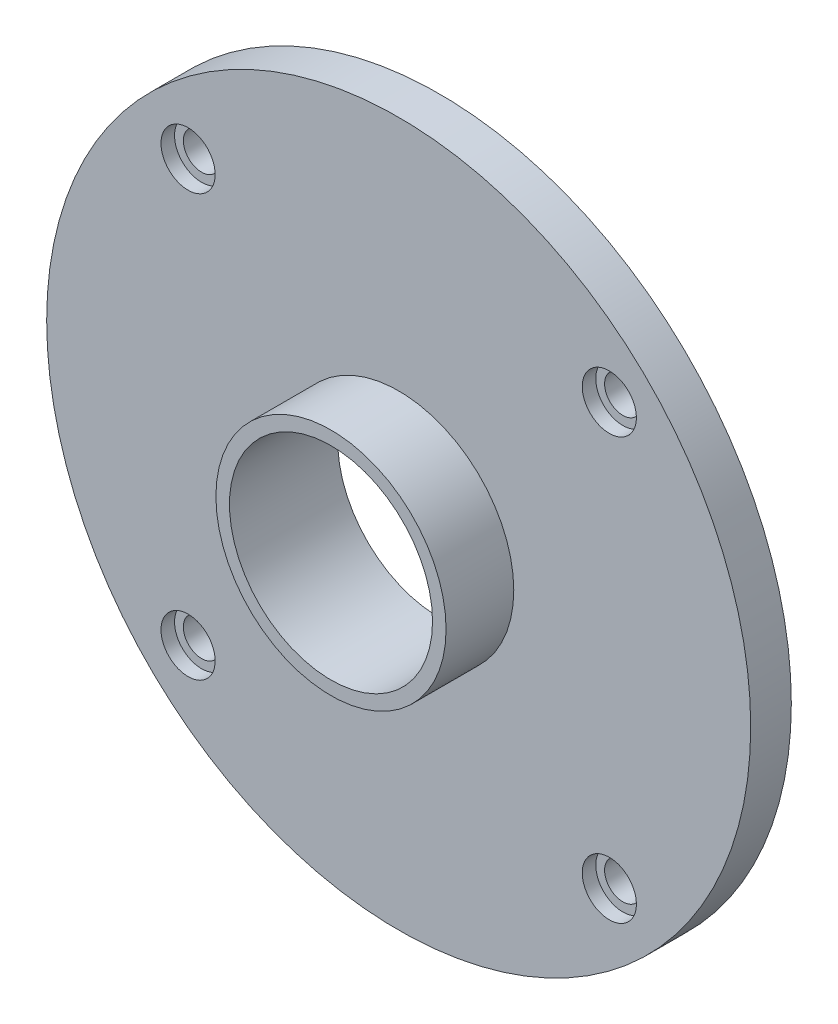
ISO-10303-21;
HEADER;
FILE_DESCRIPTION(('STEP AP214'),'2;1');
FILE_NAME('part.step','',(''),(''),'','','');
FILE_SCHEMA(('AUTOMOTIVE_DESIGN { 1 0 10303 214 1 1 1 1 }'));
ENDSEC;
DATA;
#1=APPLICATION_CONTEXT('core data for automotive mechanical design processes');
#2=APPLICATION_PROTOCOL_DEFINITION('international standard','automotive_design',2000,#1);
#3=PRODUCT_CONTEXT('',#1,'mechanical');
#4=PRODUCT('Part','Part','',(#3));
#5=PRODUCT_RELATED_PRODUCT_CATEGORY('part','',(#4));
#6=PRODUCT_DEFINITION_FORMATION('','',#4);
#7=PRODUCT_DEFINITION_CONTEXT('part definition',#1,'design');
#8=PRODUCT_DEFINITION('design','',#6,#7);
#9=PRODUCT_DEFINITION_SHAPE('','',#8);
#10=(LENGTH_UNIT() NAMED_UNIT(*) SI_UNIT(.MILLI.,.METRE.));
#11=(NAMED_UNIT(*) PLANE_ANGLE_UNIT() SI_UNIT($,.RADIAN.));
#12=(NAMED_UNIT(*) SI_UNIT($,.STERADIAN.) SOLID_ANGLE_UNIT());
#13=UNCERTAINTY_MEASURE_WITH_UNIT(LENGTH_MEASURE(1.E-05),#10,'distance_accuracy_value','');
#14=(GEOMETRIC_REPRESENTATION_CONTEXT(3) GLOBAL_UNCERTAINTY_ASSIGNED_CONTEXT((#13)) GLOBAL_UNIT_ASSIGNED_CONTEXT((#10,
#11,#12)) REPRESENTATION_CONTEXT('',''));
#15=CARTESIAN_POINT('',(0.,0.,0.));
#16=DIRECTION('',(0.,0.,1.));
#17=DIRECTION('',(1.,0.,0.));
#18=AXIS2_PLACEMENT_3D('',#15,#16,#17);
#19=CARTESIAN_POINT('',(-15.556349186104,15.5563491861041,0.));
#20=DIRECTION('',(0.,0.,1.));
#21=DIRECTION('',(1.,0.,0.));
#22=AXIS2_PLACEMENT_3D('',#19,#20,#21);
#23=CYLINDRICAL_SURFACE('',#22,1.35);
#24=CARTESIAN_POINT('',(-15.556349186104,15.5563491861041,0.));
#25=DIRECTION('',(0.,0.,1.));
#26=DIRECTION('',(1.,0.,0.));
#27=AXIS2_PLACEMENT_3D('',#24,#25,#26);
#28=CIRCLE('',#27,1.35);
#29=CARTESIAN_POINT('',(-14.206349186104,15.5563491861041,0.));
#30=VERTEX_POINT('',#29);
#31=EDGE_CURVE('E79',#30,#30,#28,.T.);
#32=ORIENTED_EDGE('',*,*,#31,.F.);
#33=EDGE_LOOP('',(#32));
#34=FACE_BOUND('',#33,.T.);
#35=CARTESIAN_POINT('',(-15.556349186104,15.5563491861041,2.));
#36=DIRECTION('',(0.,0.,1.));
#37=DIRECTION('',(1.,0.,0.));
#38=AXIS2_PLACEMENT_3D('',#35,#36,#37);
#39=CIRCLE('',#38,1.35);
#40=CARTESIAN_POINT('',(-14.206349186104,15.5563491861041,2.));
#41=VERTEX_POINT('',#40);
#42=EDGE_CURVE('E41',#41,#41,#39,.F.);
#43=ORIENTED_EDGE('',*,*,#42,.F.);
#44=EDGE_LOOP('',(#43));
#45=FACE_BOUND('',#44,.T.);
#46=ADVANCED_FACE('F37',(#34,#45),#23,.F.);
#47=CARTESIAN_POINT('',(15.5563491861041,15.5563491861049,0.));
#48=DIRECTION('',(0.,0.,1.));
#49=DIRECTION('',(1.,0.,0.));
#50=AXIS2_PLACEMENT_3D('',#47,#48,#49);
#51=CYLINDRICAL_SURFACE('',#50,1.35000000000091);
#52=CARTESIAN_POINT('',(15.5563491861041,15.5563491861049,0.));
#53=DIRECTION('',(0.,0.,1.));
#54=DIRECTION('',(1.,0.,0.));
#55=AXIS2_PLACEMENT_3D('',#52,#53,#54);
#56=CIRCLE('',#55,1.35000000000091);
#57=CARTESIAN_POINT('',(16.906349186105,15.5563491861049,0.));
#58=VERTEX_POINT('',#57);
#59=EDGE_CURVE('E75',#58,#58,#56,.T.);
#60=ORIENTED_EDGE('',*,*,#59,.F.);
#61=EDGE_LOOP('',(#60));
#62=FACE_BOUND('',#61,.T.);
#63=CARTESIAN_POINT('',(15.5563491861041,15.5563491861049,2.));
#64=DIRECTION('',(0.,0.,1.));
#65=DIRECTION('',(1.,0.,0.));
#66=AXIS2_PLACEMENT_3D('',#63,#64,#65);
#67=CIRCLE('',#66,1.35000000000091);
#68=CARTESIAN_POINT('',(16.906349186105,15.5563491861049,2.));
#69=VERTEX_POINT('',#68);
#70=EDGE_CURVE('E61',#69,#69,#67,.F.);
#71=ORIENTED_EDGE('',*,*,#70,.F.);
#72=EDGE_LOOP('',(#71));
#73=FACE_BOUND('',#72,.T.);
#74=ADVANCED_FACE('F112',(#62,#73),#51,.F.);
#75=CARTESIAN_POINT('',(15.5563491861049,-15.5563491861032,0.));
#76=DIRECTION('',(0.,0.,1.));
#77=DIRECTION('',(1.,0.,0.));
#78=AXIS2_PLACEMENT_3D('',#75,#76,#77);
#79=CYLINDRICAL_SURFACE('',#78,1.35000000000122);
#80=CARTESIAN_POINT('',(15.5563491861049,-15.5563491861032,0.));
#81=DIRECTION('',(0.,0.,1.));
#82=DIRECTION('',(1.,0.,0.));
#83=AXIS2_PLACEMENT_3D('',#80,#81,#82);
#84=CIRCLE('',#83,1.35000000000122);
#85=CARTESIAN_POINT('',(16.9063491861061,-15.5563491861032,0.));
#86=VERTEX_POINT('',#85);
#87=EDGE_CURVE('E70',#86,#86,#84,.T.);
#88=ORIENTED_EDGE('',*,*,#87,.F.);
#89=EDGE_LOOP('',(#88));
#90=FACE_BOUND('',#89,.T.);
#91=CARTESIAN_POINT('',(15.5563491861049,-15.5563491861032,2.));
#92=DIRECTION('',(0.,0.,1.));
#93=DIRECTION('',(1.,0.,0.));
#94=AXIS2_PLACEMENT_3D('',#91,#92,#93);
#95=CIRCLE('',#94,1.35000000000122);
#96=CARTESIAN_POINT('',(16.9063491861061,-15.5563491861032,2.));
#97=VERTEX_POINT('',#96);
#98=EDGE_CURVE('E58',#97,#97,#95,.F.);
#99=ORIENTED_EDGE('',*,*,#98,.F.);
#100=EDGE_LOOP('',(#99));
#101=FACE_BOUND('',#100,.T.);
#102=ADVANCED_FACE('F105',(#90,#101),#79,.F.);
#103=CARTESIAN_POINT('',(-15.5563491861032,-15.556349186104,0.));
#104=DIRECTION('',(0.,0.,1.));
#105=DIRECTION('',(1.,0.,0.));
#106=AXIS2_PLACEMENT_3D('',#103,#104,#105);
#107=CYLINDRICAL_SURFACE('',#106,1.35000000000046);
#108=CARTESIAN_POINT('',(-15.5563491861032,-15.556349186104,0.));
#109=DIRECTION('',(0.,0.,1.));
#110=DIRECTION('',(1.,0.,0.));
#111=AXIS2_PLACEMENT_3D('',#108,#109,#110);
#112=CIRCLE('',#111,1.35000000000046);
#113=CARTESIAN_POINT('',(-14.2063491861027,-15.556349186104,0.));
#114=VERTEX_POINT('',#113);
#115=EDGE_CURVE('E66',#114,#114,#112,.T.);
#116=ORIENTED_EDGE('',*,*,#115,.F.);
#117=EDGE_LOOP('',(#116));
#118=FACE_BOUND('',#117,.T.);
#119=CARTESIAN_POINT('',(-15.5563491861032,-15.556349186104,2.));
#120=DIRECTION('',(0.,0.,1.));
#121=DIRECTION('',(1.,0.,0.));
#122=AXIS2_PLACEMENT_3D('',#119,#120,#121);
#123=CIRCLE('',#122,1.35000000000046);
#124=CARTESIAN_POINT('',(-14.2063491861027,-15.556349186104,2.));
#125=VERTEX_POINT('',#124);
#126=EDGE_CURVE('E55',#125,#125,#123,.F.);
#127=ORIENTED_EDGE('',*,*,#126,.F.);
#128=EDGE_LOOP('',(#127));
#129=FACE_BOUND('',#128,.T.);
#130=ADVANCED_FACE('F95',(#118,#129),#107,.F.);
#131=CARTESIAN_POINT('',(0.,0.,3.));
#132=DIRECTION('',(0.,0.,1.));
#133=DIRECTION('',(1.,0.,0.));
#134=AXIS2_PLACEMENT_3D('',#131,#132,#133);
#135=PLANE('',#134);
#136=CARTESIAN_POINT('',(-15.5563491861032,-15.556349186104,3.));
#137=DIRECTION('',(0.,0.,1.));
#138=DIRECTION('',(1.,0.,0.));
#139=AXIS2_PLACEMENT_3D('',#136,#137,#138);
#140=CIRCLE('',#139,2.00000000000046);
#141=CARTESIAN_POINT('',(-13.5563491861027,-15.556349186104,3.));
#142=VERTEX_POINT('',#141);
#143=EDGE_CURVE('E161',#142,#142,#140,.T.);
#144=ORIENTED_EDGE('',*,*,#143,.F.);
#145=EDGE_LOOP('',(#144));
#146=FACE_BOUND('',#145,.T.);
#147=CARTESIAN_POINT('',(15.5563491861049,-15.5563491861032,3.));
#148=DIRECTION('',(0.,0.,1.));
#149=DIRECTION('',(1.,0.,0.));
#150=AXIS2_PLACEMENT_3D('',#147,#148,#149);
#151=CIRCLE('',#150,2.00000000000122);
#152=CARTESIAN_POINT('',(17.5563491861061,-15.5563491861032,3.));
#153=VERTEX_POINT('',#152);
#154=EDGE_CURVE('E167',#153,#153,#151,.T.);
#155=ORIENTED_EDGE('',*,*,#154,.F.);
#156=EDGE_LOOP('',(#155));
#157=FACE_BOUND('',#156,.T.);
#158=CARTESIAN_POINT('',(15.5563491861041,15.5563491861049,3.));
#159=DIRECTION('',(0.,0.,1.));
#160=DIRECTION('',(1.,0.,0.));
#161=AXIS2_PLACEMENT_3D('',#158,#159,#160);
#162=CIRCLE('',#161,2.00000000000091);
#163=CARTESIAN_POINT('',(17.556349186105,15.5563491861049,3.));
#164=VERTEX_POINT('',#163);
#165=EDGE_CURVE('E173',#164,#164,#162,.T.);
#166=ORIENTED_EDGE('',*,*,#165,.F.);
#167=EDGE_LOOP('',(#166));
#168=FACE_BOUND('',#167,.T.);
#169=CARTESIAN_POINT('',(-15.556349186104,15.5563491861041,3.));
#170=DIRECTION('',(0.,0.,1.));
#171=DIRECTION('',(1.,0.,0.));
#172=AXIS2_PLACEMENT_3D('',#169,#170,#171);
#173=CIRCLE('',#172,2.);
#174=CARTESIAN_POINT('',(-13.556349186104,15.5563491861041,3.));
#175=VERTEX_POINT('',#174);
#176=EDGE_CURVE('E155',#175,#175,#173,.T.);
#177=ORIENTED_EDGE('',*,*,#176,.F.);
#178=EDGE_LOOP('',(#177));
#179=FACE_BOUND('',#178,.T.);
#180=CARTESIAN_POINT('',(0.,0.,3.));
#181=DIRECTION('',(0.,0.,1.));
#182=DIRECTION('',(1.,0.,0.));
#183=AXIS2_PLACEMENT_3D('',#180,#181,#182);
#184=CIRCLE('',#183,26.);
#185=CARTESIAN_POINT('',(26.,0.,3.));
#186=VERTEX_POINT('',#185);
#187=EDGE_CURVE('E10',#186,#186,#184,.T.);
#188=ORIENTED_EDGE('',*,*,#187,.T.);
#189=EDGE_LOOP('',(#188));
#190=FACE_BOUND('',#189,.T.);
#191=CARTESIAN_POINT('',(0.,0.,3.));
#192=DIRECTION('',(0.,0.,1.));
#193=DIRECTION('',(1.,0.,0.));
#194=AXIS2_PLACEMENT_3D('',#191,#192,#193);
#195=CIRCLE('',#194,8.5);
#196=CARTESIAN_POINT('',(8.5,0.,3.));
#197=VERTEX_POINT('',#196);
#198=EDGE_CURVE('E85',#197,#197,#195,.T.);
#199=ORIENTED_EDGE('',*,*,#198,.F.);
#200=EDGE_LOOP('',(#199));
#201=FACE_BOUND('',#200,.T.);
#202=ADVANCED_FACE('F93',(#146,#157,#168,#179,#190,#201),#135,.T.);
#203=CARTESIAN_POINT('',(0.,0.,3.));
#204=DIRECTION('',(0.,0.,-1.));
#205=DIRECTION('',(-1.,0.,0.));
#206=AXIS2_PLACEMENT_3D('',#203,#204,#205);
#207=CYLINDRICAL_SURFACE('',#206,26.);
#208=ORIENTED_EDGE('',*,*,#187,.F.);
#209=EDGE_LOOP('',(#208));
#210=FACE_BOUND('',#209,.T.);
#211=CARTESIAN_POINT('',(0.,0.,0.));
#212=DIRECTION('',(0.,0.,1.));
#213=DIRECTION('',(1.,0.,0.));
#214=AXIS2_PLACEMENT_3D('',#211,#212,#213);
#215=CIRCLE('',#214,26.);
#216=CARTESIAN_POINT('',(26.,0.,0.));
#217=VERTEX_POINT('',#216);
#218=EDGE_CURVE('E45',#217,#217,#215,.T.);
#219=ORIENTED_EDGE('',*,*,#218,.T.);
#220=EDGE_LOOP('',(#219));
#221=FACE_BOUND('',#220,.T.);
#222=ADVANCED_FACE('F39',(#210,#221),#207,.T.);
#223=CARTESIAN_POINT('',(0.,0.,0.));
#224=DIRECTION('',(0.,0.,1.));
#225=DIRECTION('',(1.,0.,0.));
#226=AXIS2_PLACEMENT_3D('',#223,#224,#225);
#227=PLANE('',#226);
#228=ORIENTED_EDGE('',*,*,#115,.T.);
#229=EDGE_LOOP('',(#228));
#230=FACE_BOUND('',#229,.T.);
#231=ORIENTED_EDGE('',*,*,#87,.T.);
#232=EDGE_LOOP('',(#231));
#233=FACE_BOUND('',#232,.T.);
#234=ORIENTED_EDGE('',*,*,#59,.T.);
#235=EDGE_LOOP('',(#234));
#236=FACE_BOUND('',#235,.T.);
#237=ORIENTED_EDGE('',*,*,#31,.T.);
#238=EDGE_LOOP('',(#237));
#239=FACE_BOUND('',#238,.T.);
#240=CARTESIAN_POINT('',(0.,0.,0.));
#241=DIRECTION('',(0.,0.,1.));
#242=DIRECTION('',(1.,0.,0.));
#243=AXIS2_PLACEMENT_3D('',#240,#241,#242);
#244=CIRCLE('',#243,7.5);
#245=CARTESIAN_POINT('',(7.5,0.,0.));
#246=VERTEX_POINT('',#245);
#247=EDGE_CURVE('E50',#246,#246,#244,.T.);
#248=ORIENTED_EDGE('',*,*,#247,.T.);
#249=EDGE_LOOP('',(#248));
#250=FACE_BOUND('',#249,.T.);
#251=ORIENTED_EDGE('',*,*,#218,.F.);
#252=EDGE_LOOP('',(#251));
#253=FACE_BOUND('',#252,.T.);
#254=ADVANCED_FACE('F103',(#230,#233,#236,#239,#250,#253),#227,.F.);
#255=CARTESIAN_POINT('',(0.,0.,0.));
#256=DIRECTION('',(0.,0.,1.));
#257=DIRECTION('',(1.,0.,0.));
#258=AXIS2_PLACEMENT_3D('',#255,#256,#257);
#259=CYLINDRICAL_SURFACE('',#258,7.5);
#260=ORIENTED_EDGE('',*,*,#247,.F.);
#261=EDGE_LOOP('',(#260));
#262=FACE_BOUND('',#261,.T.);
#263=CARTESIAN_POINT('',(0.,0.,8.));
#264=DIRECTION('',(0.,0.,1.));
#265=DIRECTION('',(1.,0.,0.));
#266=AXIS2_PLACEMENT_3D('',#263,#264,#265);
#267=CIRCLE('',#266,7.5);
#268=CARTESIAN_POINT('',(7.5,0.,8.));
#269=VERTEX_POINT('',#268);
#270=EDGE_CURVE('E82',#269,#269,#267,.T.);
#271=ORIENTED_EDGE('',*,*,#270,.T.);
#272=EDGE_LOOP('',(#271));
#273=FACE_BOUND('',#272,.T.);
#274=ADVANCED_FACE('F128',(#262,#273),#259,.F.);
#275=CARTESIAN_POINT('',(0.,0.,8.));
#276=DIRECTION('',(0.,0.,1.));
#277=DIRECTION('',(1.,0.,0.));
#278=AXIS2_PLACEMENT_3D('',#275,#276,#277);
#279=PLANE('',#278);
#280=CARTESIAN_POINT('',(0.,0.,8.));
#281=DIRECTION('',(0.,0.,1.));
#282=DIRECTION('',(1.,0.,0.));
#283=AXIS2_PLACEMENT_3D('',#280,#281,#282);
#284=CIRCLE('',#283,8.5);
#285=CARTESIAN_POINT('',(8.5,0.,8.));
#286=VERTEX_POINT('',#285);
#287=EDGE_CURVE('E86',#286,#286,#284,.T.);
#288=ORIENTED_EDGE('',*,*,#287,.T.);
#289=EDGE_LOOP('',(#288));
#290=FACE_BOUND('',#289,.T.);
#291=ORIENTED_EDGE('',*,*,#270,.F.);
#292=EDGE_LOOP('',(#291));
#293=FACE_BOUND('',#292,.T.);
#294=ADVANCED_FACE('F125',(#290,#293),#279,.T.);
#295=CARTESIAN_POINT('',(0.,0.,8.));
#296=DIRECTION('',(0.,0.,-1.));
#297=DIRECTION('',(-1.,0.,0.));
#298=AXIS2_PLACEMENT_3D('',#295,#296,#297);
#299=CYLINDRICAL_SURFACE('',#298,8.5);
#300=ORIENTED_EDGE('',*,*,#287,.F.);
#301=EDGE_LOOP('',(#300));
#302=FACE_BOUND('',#301,.T.);
#303=ORIENTED_EDGE('',*,*,#198,.T.);
#304=EDGE_LOOP('',(#303));
#305=FACE_BOUND('',#304,.T.);
#306=ADVANCED_FACE('F91',(#302,#305),#299,.T.);
#307=CARTESIAN_POINT('',(-15.5563491861032,-15.556349186104,2.));
#308=DIRECTION('',(0.,0.,1.));
#309=DIRECTION('',(1.,0.,0.));
#310=AXIS2_PLACEMENT_3D('',#307,#308,#309);
#311=PLANE('',#310);
#312=CARTESIAN_POINT('',(-15.5563491861032,-15.556349186104,2.));
#313=DIRECTION('',(0.,0.,1.));
#314=DIRECTION('',(1.,0.,0.));
#315=AXIS2_PLACEMENT_3D('',#312,#313,#314);
#316=CIRCLE('',#315,2.00000000000046);
#317=CARTESIAN_POINT('',(-13.5563491861027,-15.556349186104,2.));
#318=VERTEX_POINT('',#317);
#319=EDGE_CURVE('E164',#318,#318,#316,.T.);
#320=ORIENTED_EDGE('',*,*,#319,.T.);
#321=EDGE_LOOP('',(#320));
#322=FACE_BOUND('',#321,.T.);
#323=ORIENTED_EDGE('',*,*,#126,.T.);
#324=EDGE_LOOP('',(#323));
#325=FACE_BOUND('',#324,.T.);
#326=ADVANCED_FACE('F131',(#322,#325),#311,.T.);
#327=CARTESIAN_POINT('',(-15.5563491861032,-15.556349186104,2.));
#328=DIRECTION('',(0.,0.,1.));
#329=DIRECTION('',(1.,0.,0.));
#330=AXIS2_PLACEMENT_3D('',#327,#328,#329);
#331=CYLINDRICAL_SURFACE('',#330,2.00000000000046);
#332=ORIENTED_EDGE('',*,*,#319,.F.);
#333=EDGE_LOOP('',(#332));
#334=FACE_BOUND('',#333,.T.);
#335=ORIENTED_EDGE('',*,*,#143,.T.);
#336=EDGE_LOOP('',(#335));
#337=FACE_BOUND('',#336,.T.);
#338=ADVANCED_FACE('F212',(#334,#337),#331,.F.);
#339=CARTESIAN_POINT('',(15.5563491861049,-15.5563491861032,2.));
#340=DIRECTION('',(0.,0.,1.));
#341=DIRECTION('',(1.,0.,0.));
#342=AXIS2_PLACEMENT_3D('',#339,#340,#341);
#343=PLANE('',#342);
#344=CARTESIAN_POINT('',(15.5563491861049,-15.5563491861032,2.));
#345=DIRECTION('',(0.,0.,1.));
#346=DIRECTION('',(1.,0.,0.));
#347=AXIS2_PLACEMENT_3D('',#344,#345,#346);
#348=CIRCLE('',#347,2.00000000000122);
#349=CARTESIAN_POINT('',(17.5563491861061,-15.5563491861032,2.));
#350=VERTEX_POINT('',#349);
#351=EDGE_CURVE('E170',#350,#350,#348,.T.);
#352=ORIENTED_EDGE('',*,*,#351,.T.);
#353=EDGE_LOOP('',(#352));
#354=FACE_BOUND('',#353,.T.);
#355=ORIENTED_EDGE('',*,*,#98,.T.);
#356=EDGE_LOOP('',(#355));
#357=FACE_BOUND('',#356,.T.);
#358=ADVANCED_FACE('F209',(#354,#357),#343,.T.);
#359=CARTESIAN_POINT('',(15.5563491861049,-15.5563491861032,2.));
#360=DIRECTION('',(0.,0.,1.));
#361=DIRECTION('',(1.,0.,0.));
#362=AXIS2_PLACEMENT_3D('',#359,#360,#361);
#363=CYLINDRICAL_SURFACE('',#362,2.00000000000122);
#364=ORIENTED_EDGE('',*,*,#351,.F.);
#365=EDGE_LOOP('',(#364));
#366=FACE_BOUND('',#365,.T.);
#367=ORIENTED_EDGE('',*,*,#154,.T.);
#368=EDGE_LOOP('',(#367));
#369=FACE_BOUND('',#368,.T.);
#370=ADVANCED_FACE('F211',(#366,#369),#363,.F.);
#371=CARTESIAN_POINT('',(15.5563491861041,15.5563491861049,2.));
#372=DIRECTION('',(0.,0.,1.));
#373=DIRECTION('',(1.,0.,0.));
#374=AXIS2_PLACEMENT_3D('',#371,#372,#373);
#375=PLANE('',#374);
#376=CARTESIAN_POINT('',(15.5563491861041,15.5563491861049,2.));
#377=DIRECTION('',(0.,0.,1.));
#378=DIRECTION('',(1.,0.,0.));
#379=AXIS2_PLACEMENT_3D('',#376,#377,#378);
#380=CIRCLE('',#379,2.00000000000091);
#381=CARTESIAN_POINT('',(17.556349186105,15.5563491861049,2.));
#382=VERTEX_POINT('',#381);
#383=EDGE_CURVE('E158',#382,#382,#380,.T.);
#384=ORIENTED_EDGE('',*,*,#383,.T.);
#385=EDGE_LOOP('',(#384));
#386=FACE_BOUND('',#385,.T.);
#387=ORIENTED_EDGE('',*,*,#70,.T.);
#388=EDGE_LOOP('',(#387));
#389=FACE_BOUND('',#388,.T.);
#390=ADVANCED_FACE('F179',(#386,#389),#375,.T.);
#391=CARTESIAN_POINT('',(15.5563491861041,15.5563491861049,2.));
#392=DIRECTION('',(0.,0.,1.));
#393=DIRECTION('',(1.,0.,0.));
#394=AXIS2_PLACEMENT_3D('',#391,#392,#393);
#395=CYLINDRICAL_SURFACE('',#394,2.00000000000091);
#396=ORIENTED_EDGE('',*,*,#383,.F.);
#397=EDGE_LOOP('',(#396));
#398=FACE_BOUND('',#397,.T.);
#399=ORIENTED_EDGE('',*,*,#165,.T.);
#400=EDGE_LOOP('',(#399));
#401=FACE_BOUND('',#400,.T.);
#402=ADVANCED_FACE('F181',(#398,#401),#395,.F.);
#403=CARTESIAN_POINT('',(-15.556349186104,15.5563491861041,2.));
#404=DIRECTION('',(0.,0.,1.));
#405=DIRECTION('',(1.,0.,0.));
#406=AXIS2_PLACEMENT_3D('',#403,#404,#405);
#407=PLANE('',#406);
#408=CARTESIAN_POINT('',(-15.556349186104,15.5563491861041,2.));
#409=DIRECTION('',(0.,0.,1.));
#410=DIRECTION('',(1.,0.,0.));
#411=AXIS2_PLACEMENT_3D('',#408,#409,#410);
#412=CIRCLE('',#411,2.);
#413=CARTESIAN_POINT('',(-13.556349186104,15.5563491861041,2.));
#414=VERTEX_POINT('',#413);
#415=EDGE_CURVE('E59',#414,#414,#412,.T.);
#416=ORIENTED_EDGE('',*,*,#415,.T.);
#417=EDGE_LOOP('',(#416));
#418=FACE_BOUND('',#417,.T.);
#419=ORIENTED_EDGE('',*,*,#42,.T.);
#420=EDGE_LOOP('',(#419));
#421=FACE_BOUND('',#420,.T.);
#422=ADVANCED_FACE('F184',(#418,#421),#407,.T.);
#423=CARTESIAN_POINT('',(-15.556349186104,15.5563491861041,2.));
#424=DIRECTION('',(0.,0.,1.));
#425=DIRECTION('',(1.,0.,0.));
#426=AXIS2_PLACEMENT_3D('',#423,#424,#425);
#427=CYLINDRICAL_SURFACE('',#426,2.);
#428=ORIENTED_EDGE('',*,*,#415,.F.);
#429=EDGE_LOOP('',(#428));
#430=FACE_BOUND('',#429,.T.);
#431=ORIENTED_EDGE('',*,*,#176,.T.);
#432=EDGE_LOOP('',(#431));
#433=FACE_BOUND('',#432,.T.);
#434=ADVANCED_FACE('F191',(#430,#433),#427,.F.);
#435=CLOSED_SHELL('',(#46,#74,#102,#130,#202,#222,#254,#274,#294,#306,#326,#338,#358,#370,#390,
#402,#422,#434));
#436=MANIFOLD_SOLID_BREP('B2',#435);
#437=ADVANCED_BREP_SHAPE_REPRESENTATION('',(#18,#436),#14);
#438=SHAPE_DEFINITION_REPRESENTATION(#9,#437);
ENDSEC;
END-ISO-10303-21;
